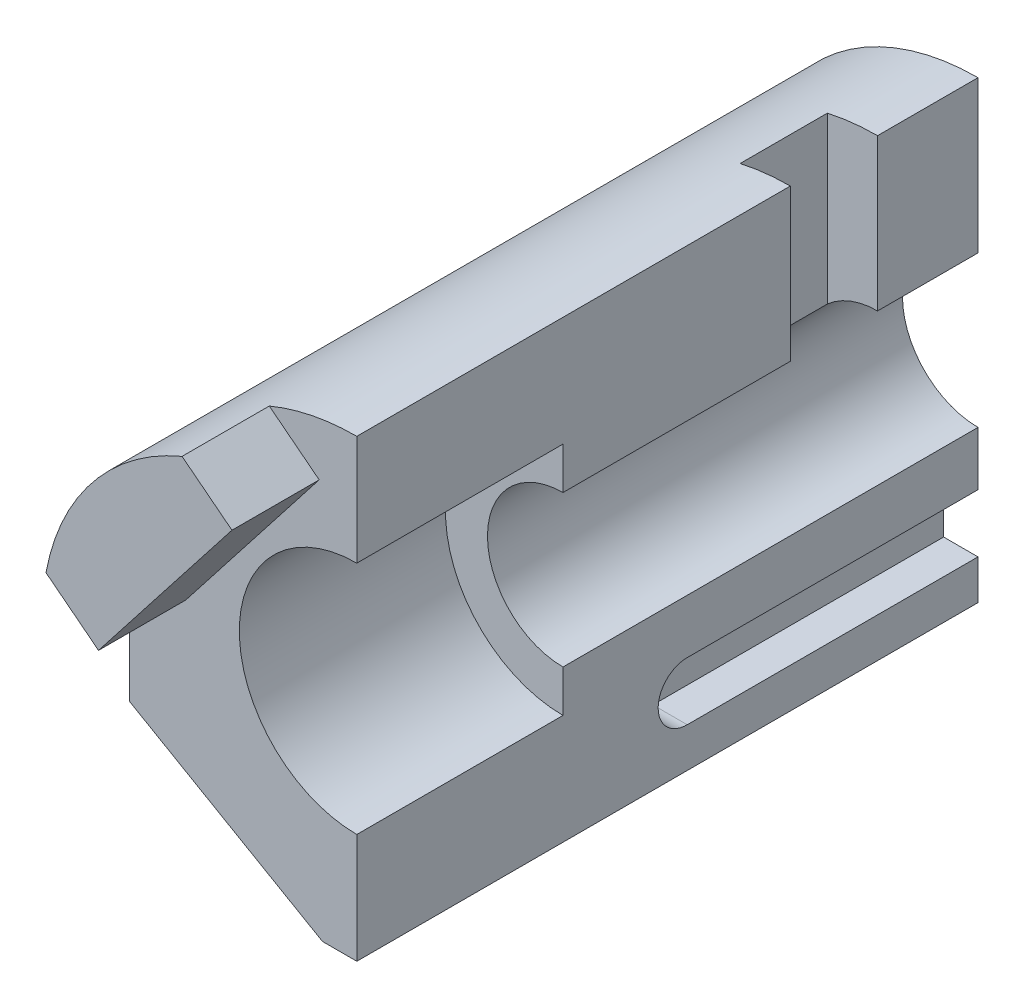
ISO-10303-21;
HEADER;
FILE_DESCRIPTION(('STEP AP214'),'2;1');
FILE_NAME('part.step','',(''),(''),'','','');
FILE_SCHEMA(('AUTOMOTIVE_DESIGN { 1 0 10303 214 1 1 1 1 }'));
ENDSEC;
DATA;
#1=APPLICATION_CONTEXT('core data for automotive mechanical design processes');
#2=APPLICATION_PROTOCOL_DEFINITION('international standard','automotive_design',2000,#1);
#3=PRODUCT_CONTEXT('',#1,'mechanical');
#4=PRODUCT('Part','Part','',(#3));
#5=PRODUCT_RELATED_PRODUCT_CATEGORY('part','',(#4));
#6=PRODUCT_DEFINITION_FORMATION('','',#4);
#7=PRODUCT_DEFINITION_CONTEXT('part definition',#1,'design');
#8=PRODUCT_DEFINITION('design','',#6,#7);
#9=PRODUCT_DEFINITION_SHAPE('','',#8);
#10=(LENGTH_UNIT() NAMED_UNIT(*) SI_UNIT(.MILLI.,.METRE.));
#11=(NAMED_UNIT(*) PLANE_ANGLE_UNIT() SI_UNIT($,.RADIAN.));
#12=(NAMED_UNIT(*) SI_UNIT($,.STERADIAN.) SOLID_ANGLE_UNIT());
#13=UNCERTAINTY_MEASURE_WITH_UNIT(LENGTH_MEASURE(1.E-05),#10,'distance_accuracy_value','');
#14=(GEOMETRIC_REPRESENTATION_CONTEXT(3) GLOBAL_UNCERTAINTY_ASSIGNED_CONTEXT((#13)) GLOBAL_UNIT_ASSIGNED_CONTEXT((#10,
#11,#12)) REPRESENTATION_CONTEXT('',''));
#15=CARTESIAN_POINT('',(0.,0.,0.));
#16=DIRECTION('',(0.,0.,1.));
#17=DIRECTION('',(1.,0.,0.));
#18=AXIS2_PLACEMENT_3D('',#15,#16,#17);
#19=CARTESIAN_POINT('',(0.,-86.,235.));
#20=DIRECTION('',(-1.,0.,0.));
#21=DIRECTION('',(0.,0.,1.));
#22=AXIS2_PLACEMENT_3D('',#19,#20,#21);
#23=PLANE('',#22);
#24=DIRECTION('',(0.,0.,-1.));
#25=VECTOR('',#24,1.);
#26=CARTESIAN_POINT('',(0.,-49.,0.));
#27=LINE('',#26,#25);
#28=CARTESIAN_POINT('',(0.,-49.,110.));
#29=VERTEX_POINT('',#28);
#30=CARTESIAN_POINT('',(0.,-49.,0.));
#31=VERTEX_POINT('',#30);
#32=EDGE_CURVE('E194',#29,#31,#27,.T.);
#33=ORIENTED_EDGE('',*,*,#32,.T.);
#34=DIRECTION('',(0.,1.,0.));
#35=VECTOR('',#34,1.);
#36=CARTESIAN_POINT('',(0.,-86.,0.));
#37=LINE('',#36,#35);
#38=CARTESIAN_POINT('',(0.,-28.575,0.));
#39=VERTEX_POINT('',#38);
#40=EDGE_CURVE('E318',#31,#39,#37,.T.);
#41=ORIENTED_EDGE('',*,*,#40,.T.);
#42=DIRECTION('',(0.,0.,1.));
#43=VECTOR('',#42,1.);
#44=CARTESIAN_POINT('',(0.,-28.575,0.));
#45=LINE('',#44,#43);
#46=CARTESIAN_POINT('',(0.,-28.575,157.));
#47=VERTEX_POINT('',#46);
#48=EDGE_CURVE('E277',#39,#47,#45,.T.);
#49=ORIENTED_EDGE('',*,*,#48,.T.);
#50=DIRECTION('',(0.,1.,0.));
#51=VECTOR('',#50,1.);
#52=CARTESIAN_POINT('',(0.,-86.,157.));
#53=LINE('',#52,#51);
#54=CARTESIAN_POINT('',(0.,-44.45,157.));
#55=VERTEX_POINT('',#54);
#56=EDGE_CURVE('E335',#55,#47,#53,.T.);
#57=ORIENTED_EDGE('',*,*,#56,.F.);
#58=DIRECTION('',(0.,0.,1.));
#59=VECTOR('',#58,1.);
#60=CARTESIAN_POINT('',(0.,-44.45,157.));
#61=LINE('',#60,#59);
#62=CARTESIAN_POINT('',(0.,-44.45,235.));
#63=VERTEX_POINT('',#62);
#64=EDGE_CURVE('E288',#55,#63,#61,.T.);
#65=ORIENTED_EDGE('',*,*,#64,.T.);
#66=DIRECTION('',(0.,1.,0.));
#67=VECTOR('',#66,1.);
#68=CARTESIAN_POINT('',(0.,-86.,235.));
#69=LINE('',#68,#67);
#70=CARTESIAN_POINT('',(0.,-86.,235.));
#71=VERTEX_POINT('',#70);
#72=EDGE_CURVE('E302',#71,#63,#69,.T.);
#73=ORIENTED_EDGE('',*,*,#72,.F.);
#74=DIRECTION('',(0.,0.,-1.));
#75=VECTOR('',#74,1.);
#76=CARTESIAN_POINT('',(0.,-86.,235.));
#77=LINE('',#76,#75);
#78=CARTESIAN_POINT('',(0.,-86.,0.));
#79=VERTEX_POINT('',#78);
#80=EDGE_CURVE('E322',#71,#79,#77,.T.);
#81=ORIENTED_EDGE('',*,*,#80,.T.);
#82=CARTESIAN_POINT('',(0.,-71.,0.));
#83=VERTEX_POINT('',#82);
#84=EDGE_CURVE('E315',#79,#83,#37,.T.);
#85=ORIENTED_EDGE('',*,*,#84,.T.);
#86=DIRECTION('',(0.,0.,-1.));
#87=VECTOR('',#86,1.);
#88=CARTESIAN_POINT('',(0.,-71.,0.));
#89=LINE('',#88,#87);
#90=CARTESIAN_POINT('',(0.,-71.,110.));
#91=VERTEX_POINT('',#90);
#92=EDGE_CURVE('E206',#91,#83,#89,.T.);
#93=ORIENTED_EDGE('',*,*,#92,.F.);
#94=CARTESIAN_POINT('',(0.,-60.,110.));
#95=DIRECTION('',(1.,0.,0.));
#96=DIRECTION('',(0.,0.,-1.));
#97=AXIS2_PLACEMENT_3D('',#94,#95,#96);
#98=CIRCLE('',#97,11.);
#99=EDGE_CURVE('E214',#29,#91,#98,.T.);
#100=ORIENTED_EDGE('',*,*,#99,.F.);
#101=EDGE_LOOP('',(#33,#41,#49,#57,#65,#73,#81,#85,#93,#100));
#102=FACE_BOUND('',#101,.T.);
#103=ADVANCED_FACE('F45',(#102),#23,.F.);
#104=CARTESIAN_POINT('',(0.,0.,0.));
#105=DIRECTION('',(0.,0.,1.));
#106=DIRECTION('',(1.,0.,0.));
#107=AXIS2_PLACEMENT_3D('',#104,#105,#106);
#108=PLANE('',#107);
#109=DIRECTION('',(1.,0.,0.));
#110=VECTOR('',#109,1.);
#111=CARTESIAN_POINT('',(-13.,-49.,0.));
#112=LINE('',#111,#110);
#113=CARTESIAN_POINT('',(-13.,-49.,0.));
#114=VERTEX_POINT('',#113);
#115=EDGE_CURVE('E217',#114,#31,#112,.T.);
#116=ORIENTED_EDGE('',*,*,#115,.F.);
#117=DIRECTION('',(0.,1.,0.));
#118=VECTOR('',#117,1.);
#119=CARTESIAN_POINT('',(-13.,0.,0.));
#120=LINE('',#119,#118);
#121=CARTESIAN_POINT('',(-13.,-71.,0.));
#122=VERTEX_POINT('',#121);
#123=EDGE_CURVE('E200',#122,#114,#120,.T.);
#124=ORIENTED_EDGE('',*,*,#123,.F.);
#125=DIRECTION('',(1.,0.,0.));
#126=VECTOR('',#125,1.);
#127=CARTESIAN_POINT('',(-13.,-71.,0.));
#128=LINE('',#127,#126);
#129=EDGE_CURVE('E220',#122,#83,#128,.T.);
#130=ORIENTED_EDGE('',*,*,#129,.T.);
#131=ORIENTED_EDGE('',*,*,#84,.F.);
#132=DIRECTION('',(1.,0.,0.));
#133=VECTOR('',#132,1.);
#134=CARTESIAN_POINT('',(0.,-86.,0.));
#135=LINE('',#134,#133);
#136=CARTESIAN_POINT('',(-13.,-86.,0.));
#137=VERTEX_POINT('',#136);
#138=EDGE_CURVE('E312',#137,#79,#135,.T.);
#139=ORIENTED_EDGE('',*,*,#138,.F.);
#140=DIRECTION('',(0.866025403784438,-0.500000000000001,0.));
#141=VECTOR('',#140,1.);
#142=CARTESIAN_POINT('',(-13.,-86.,0.));
#143=LINE('',#142,#141);
#144=CARTESIAN_POINT('',(-86.,-43.8534303491572,0.));
#145=VERTEX_POINT('',#144);
#146=EDGE_CURVE('E310',#145,#137,#143,.T.);
#147=ORIENTED_EDGE('',*,*,#146,.F.);
#148=DIRECTION('',(0.,-1.,0.));
#149=VECTOR('',#148,1.);
#150=CARTESIAN_POINT('',(-86.,-6.00534790281019E-13,0.));
#151=LINE('',#150,#149);
#152=CARTESIAN_POINT('',(-86.,-6.00534790281019E-13,0.));
#153=VERTEX_POINT('',#152);
#154=EDGE_CURVE('E308',#153,#145,#151,.T.);
#155=ORIENTED_EDGE('',*,*,#154,.F.);
#156=CARTESIAN_POINT('',(0.,0.,0.));
#157=DIRECTION('',(0.,0.,1.));
#158=DIRECTION('',(1.,0.,0.));
#159=AXIS2_PLACEMENT_3D('',#156,#157,#158);
#160=CIRCLE('',#159,86.);
#161=CARTESIAN_POINT('',(0.,86.,0.));
#162=VERTEX_POINT('',#161);
#163=EDGE_CURVE('E291',#162,#153,#160,.T.);
#164=ORIENTED_EDGE('',*,*,#163,.F.);
#165=CARTESIAN_POINT('',(0.,28.575,0.));
#166=VERTEX_POINT('',#165);
#167=EDGE_CURVE('E314',#166,#162,#37,.T.);
#168=ORIENTED_EDGE('',*,*,#167,.F.);
#169=CARTESIAN_POINT('',(0.,0.,0.));
#170=DIRECTION('',(0.,0.,1.));
#171=DIRECTION('',(1.,0.,0.));
#172=AXIS2_PLACEMENT_3D('',#169,#170,#171);
#173=CIRCLE('',#172,28.575);
#174=EDGE_CURVE('E269',#166,#39,#173,.T.);
#175=ORIENTED_EDGE('',*,*,#174,.T.);
#176=ORIENTED_EDGE('',*,*,#40,.F.);
#177=EDGE_LOOP('',(#116,#124,#130,#131,#139,#147,#155,#164,#168,#175,#176));
#178=FACE_BOUND('',#177,.T.);
#179=ADVANCED_FACE('F373',(#178),#108,.F.);
#180=DIRECTION('',(0.,0.,-1.));
#181=VECTOR('',#180,1.);
#182=CARTESIAN_POINT('',(0.,86.,235.));
#183=LINE('',#182,#181);
#184=CARTESIAN_POINT('',(0.,86.,38.));
#185=VERTEX_POINT('',#184);
#186=EDGE_CURVE('E305',#185,#162,#183,.T.);
#187=ORIENTED_EDGE('',*,*,#186,.F.);
#188=DIRECTION('',(0.,1.,0.));
#189=VECTOR('',#188,1.);
#190=CARTESIAN_POINT('',(0.,4.33599972747388,38.));
#191=LINE('',#190,#189);
#192=CARTESIAN_POINT('',(0.,28.575,38.));
#193=VERTEX_POINT('',#192);
#194=EDGE_CURVE('E219',#193,#185,#191,.T.);
#195=ORIENTED_EDGE('',*,*,#194,.F.);
#196=DIRECTION('',(0.,0.,1.));
#197=VECTOR('',#196,1.);
#198=CARTESIAN_POINT('',(0.,28.575,0.));
#199=LINE('',#198,#197);
#200=EDGE_CURVE('E272',#193,#166,#199,.F.);
#201=ORIENTED_EDGE('',*,*,#200,.T.);
#202=ORIENTED_EDGE('',*,*,#167,.T.);
#203=EDGE_LOOP('',(#187,#195,#201,#202));
#204=FACE_BOUND('',#203,.T.);
#205=ADVANCED_FACE('F385',(#204),#23,.F.);
#206=CARTESIAN_POINT('',(0.,0.,235.));
#207=DIRECTION('',(0.,0.,1.));
#208=DIRECTION('',(1.,0.,0.));
#209=AXIS2_PLACEMENT_3D('',#206,#207,#208);
#210=PLANE('',#209);
#211=DIRECTION('',(0.61566147532566,0.788010753606721,0.));
#212=VECTOR('',#211,1.);
#213=CARTESIAN_POINT('',(-40.1885484339428,31.3987352416086,235.));
#214=LINE('',#213,#212);
#215=CARTESIAN_POINT('',(-64.7199289687016,0.,235.));
#216=VERTEX_POINT('',#215);
#217=CARTESIAN_POINT('',(-14.2356879919975,64.6168817957511,235.));
#218=VERTEX_POINT('',#217);
#219=EDGE_CURVE('E252',#216,#218,#214,.T.);
#220=ORIENTED_EDGE('',*,*,#219,.F.);
#221=DIRECTION('',(-0.788010753606721,0.615661475325659,0.));
#222=VECTOR('',#221,1.);
#223=CARTESIAN_POINT('',(-24.5313805347588,-31.3987352416086,235.));
#224=LINE('',#223,#222);
#225=CARTESIAN_POINT('',(-84.587575845109,15.5223069370482,235.));
#226=VERTEX_POINT('',#225);
#227=EDGE_CURVE('E239',#216,#226,#224,.T.);
#228=ORIENTED_EDGE('',*,*,#227,.T.);
#229=CARTESIAN_POINT('',(0.,0.,235.));
#230=DIRECTION('',(0.,0.,1.));
#231=DIRECTION('',(1.,0.,0.));
#232=AXIS2_PLACEMENT_3D('',#229,#230,#231);
#233=CIRCLE('',#232,86.);
#234=CARTESIAN_POINT('',(-86.,-6.00534790281019E-13,235.));
#235=VERTEX_POINT('',#234);
#236=EDGE_CURVE('E295',#226,#235,#233,.T.);
#237=ORIENTED_EDGE('',*,*,#236,.T.);
#238=DIRECTION('',(0.,-1.,0.));
#239=VECTOR('',#238,1.);
#240=CARTESIAN_POINT('',(-86.,-6.00534790281019E-13,235.));
#241=LINE('',#240,#239);
#242=CARTESIAN_POINT('',(-86.,-43.8534303491572,235.));
#243=VERTEX_POINT('',#242);
#244=EDGE_CURVE('E294',#235,#243,#241,.T.);
#245=ORIENTED_EDGE('',*,*,#244,.T.);
#246=DIRECTION('',(0.866025403784438,-0.500000000000001,0.));
#247=VECTOR('',#246,1.);
#248=CARTESIAN_POINT('',(-13.,-86.,235.));
#249=LINE('',#248,#247);
#250=CARTESIAN_POINT('',(-13.,-86.,235.));
#251=VERTEX_POINT('',#250);
#252=EDGE_CURVE('E297',#243,#251,#249,.T.);
#253=ORIENTED_EDGE('',*,*,#252,.T.);
#254=DIRECTION('',(1.,0.,0.));
#255=VECTOR('',#254,1.);
#256=CARTESIAN_POINT('',(0.,-86.,235.));
#257=LINE('',#256,#255);
#258=EDGE_CURVE('E299',#251,#71,#257,.T.);
#259=ORIENTED_EDGE('',*,*,#258,.T.);
#260=ORIENTED_EDGE('',*,*,#72,.T.);
#261=CARTESIAN_POINT('',(0.,0.,235.));
#262=DIRECTION('',(0.,0.,1.));
#263=DIRECTION('',(1.,0.,0.));
#264=AXIS2_PLACEMENT_3D('',#261,#262,#263);
#265=CIRCLE('',#264,44.45);
#266=CARTESIAN_POINT('',(0.,44.45,235.));
#267=VERTEX_POINT('',#266);
#268=EDGE_CURVE('E280',#267,#63,#265,.T.);
#269=ORIENTED_EDGE('',*,*,#268,.F.);
#270=CARTESIAN_POINT('',(0.,86.,235.));
#271=VERTEX_POINT('',#270);
#272=EDGE_CURVE('E301',#267,#271,#69,.T.);
#273=ORIENTED_EDGE('',*,*,#272,.T.);
#274=CARTESIAN_POINT('',(-33.116437077452,79.3681396738966,235.));
#275=VERTEX_POINT('',#274);
#276=EDGE_CURVE('E292',#271,#275,#233,.T.);
#277=ORIENTED_EDGE('',*,*,#276,.T.);
#278=DIRECTION('',(-0.788010753606721,0.61566147532566,0.));
#279=VECTOR('',#278,1.);
#280=CARTESIAN_POINT('',(25.9528604419453,33.2181465541425,235.));
#281=LINE('',#280,#279);
#282=EDGE_CURVE('E244',#218,#275,#281,.T.);
#283=ORIENTED_EDGE('',*,*,#282,.F.);
#284=EDGE_LOOP('',(#220,#228,#237,#245,#253,#259,#260,#269,#273,#277,#283));
#285=FACE_BOUND('',#284,.T.);
#286=ADVANCED_FACE('F362',(#285),#210,.T.);
#287=CARTESIAN_POINT('',(0.,0.,235.));
#288=DIRECTION('',(0.,0.,-1.));
#289=DIRECTION('',(-1.,0.,0.));
#290=AXIS2_PLACEMENT_3D('',#287,#288,#289);
#291=CYLINDRICAL_SURFACE('',#290,86.);
#292=DIRECTION('',(0.,0.,-1.));
#293=VECTOR('',#292,1.);
#294=CARTESIAN_POINT('',(-19.,83.8749068553879,235.));
#295=LINE('',#294,#293);
#296=CARTESIAN_POINT('',(-19.,83.8749068553879,38.));
#297=VERTEX_POINT('',#296);
#298=CARTESIAN_POINT('',(-19.,83.8749068553879,71.));
#299=VERTEX_POINT('',#298);
#300=EDGE_CURVE('E229',#297,#299,#295,.F.);
#301=ORIENTED_EDGE('',*,*,#300,.F.);
#302=CARTESIAN_POINT('',(0.,0.,38.));
#303=DIRECTION('',(0.,0.,-1.));
#304=DIRECTION('',(-1.,0.,0.));
#305=AXIS2_PLACEMENT_3D('',#302,#303,#304);
#306=CIRCLE('',#305,86.);
#307=EDGE_CURVE('E236',#297,#185,#306,.T.);
#308=ORIENTED_EDGE('',*,*,#307,.T.);
#309=ORIENTED_EDGE('',*,*,#186,.T.);
#310=ORIENTED_EDGE('',*,*,#163,.T.);
#311=DIRECTION('',(0.,0.,-1.));
#312=VECTOR('',#311,1.);
#313=CARTESIAN_POINT('',(-86.,-6.00534790281019E-13,235.));
#314=LINE('',#313,#312);
#315=EDGE_CURVE('E331',#235,#153,#314,.T.);
#316=ORIENTED_EDGE('',*,*,#315,.F.);
#317=ORIENTED_EDGE('',*,*,#236,.F.);
#318=DIRECTION('',(0.,0.,-1.));
#319=VECTOR('',#318,1.);
#320=CARTESIAN_POINT('',(-84.587575845109,15.5223069370482,268.));
#321=LINE('',#320,#319);
#322=CARTESIAN_POINT('',(-84.587575845109,15.5223069370482,268.));
#323=VERTEX_POINT('',#322);
#324=EDGE_CURVE('E250',#323,#226,#321,.T.);
#325=ORIENTED_EDGE('',*,*,#324,.F.);
#326=CARTESIAN_POINT('',(0.,0.,268.));
#327=DIRECTION('',(0.,0.,1.));
#328=DIRECTION('',(1.,0.,0.));
#329=AXIS2_PLACEMENT_3D('',#326,#327,#328);
#330=CIRCLE('',#329,86.);
#331=CARTESIAN_POINT('',(-33.116437077452,79.3681396738966,268.));
#332=VERTEX_POINT('',#331);
#333=EDGE_CURVE('E248',#332,#323,#330,.T.);
#334=ORIENTED_EDGE('',*,*,#333,.F.);
#335=DIRECTION('',(0.,0.,-1.));
#336=VECTOR('',#335,1.);
#337=CARTESIAN_POINT('',(-33.116437077452,79.3681396738966,268.));
#338=LINE('',#337,#336);
#339=EDGE_CURVE('E259',#332,#275,#338,.T.);
#340=ORIENTED_EDGE('',*,*,#339,.T.);
#341=ORIENTED_EDGE('',*,*,#276,.F.);
#342=CARTESIAN_POINT('',(0.,86.,71.));
#343=VERTEX_POINT('',#342);
#344=EDGE_CURVE('E319',#271,#343,#183,.T.);
#345=ORIENTED_EDGE('',*,*,#344,.T.);
#346=CARTESIAN_POINT('',(0.,0.,71.));
#347=DIRECTION('',(0.,0.,1.));
#348=DIRECTION('',(0.,-1.,0.));
#349=AXIS2_PLACEMENT_3D('',#346,#347,#348);
#350=CIRCLE('',#349,86.);
#351=EDGE_CURVE('E233',#343,#299,#350,.T.);
#352=ORIENTED_EDGE('',*,*,#351,.T.);
#353=EDGE_LOOP('',(#301,#308,#309,#310,#316,#317,#325,#334,#340,#341,#345,#352));
#354=FACE_BOUND('',#353,.T.);
#355=ADVANCED_FACE('F47',(#354),#291,.T.);
#356=CARTESIAN_POINT('',(-86.,-6.00534790281019E-13,235.));
#357=DIRECTION('',(1.,0.,0.));
#358=DIRECTION('',(0.,1.,0.));
#359=AXIS2_PLACEMENT_3D('',#356,#357,#358);
#360=PLANE('',#359);
#361=ORIENTED_EDGE('',*,*,#154,.T.);
#362=DIRECTION('',(0.,0.,-1.));
#363=VECTOR('',#362,1.);
#364=CARTESIAN_POINT('',(-86.,-43.8534303491572,235.));
#365=LINE('',#364,#363);
#366=EDGE_CURVE('E328',#243,#145,#365,.T.);
#367=ORIENTED_EDGE('',*,*,#366,.F.);
#368=ORIENTED_EDGE('',*,*,#244,.F.);
#369=ORIENTED_EDGE('',*,*,#315,.T.);
#370=EDGE_LOOP('',(#361,#367,#368,#369));
#371=FACE_BOUND('',#370,.T.);
#372=ADVANCED_FACE('F444',(#371),#360,.F.);
#373=CARTESIAN_POINT('',(-13.,-86.,235.));
#374=DIRECTION('',(0.500000000000001,0.866025403784438,0.));
#375=DIRECTION('',(-0.866025403784438,0.500000000000001,0.));
#376=AXIS2_PLACEMENT_3D('',#373,#374,#375);
#377=PLANE('',#376);
#378=ORIENTED_EDGE('',*,*,#146,.T.);
#379=DIRECTION('',(0.,0.,-1.));
#380=VECTOR('',#379,1.);
#381=CARTESIAN_POINT('',(-13.,-86.,235.));
#382=LINE('',#381,#380);
#383=EDGE_CURVE('E325',#251,#137,#382,.T.);
#384=ORIENTED_EDGE('',*,*,#383,.F.);
#385=ORIENTED_EDGE('',*,*,#252,.F.);
#386=ORIENTED_EDGE('',*,*,#366,.T.);
#387=EDGE_LOOP('',(#378,#384,#385,#386));
#388=FACE_BOUND('',#387,.T.);
#389=ADVANCED_FACE('F439',(#388),#377,.F.);
#390=CARTESIAN_POINT('',(0.,-86.,235.));
#391=DIRECTION('',(0.,1.,0.));
#392=DIRECTION('',(0.,0.,1.));
#393=AXIS2_PLACEMENT_3D('',#390,#391,#392);
#394=PLANE('',#393);
#395=ORIENTED_EDGE('',*,*,#138,.T.);
#396=ORIENTED_EDGE('',*,*,#80,.F.);
#397=ORIENTED_EDGE('',*,*,#258,.F.);
#398=ORIENTED_EDGE('',*,*,#383,.T.);
#399=EDGE_LOOP('',(#395,#396,#397,#398));
#400=FACE_BOUND('',#399,.T.);
#401=ADVANCED_FACE('F368',(#400),#394,.F.);
#402=CARTESIAN_POINT('',(0.,28.575,157.));
#403=VERTEX_POINT('',#402);
#404=CARTESIAN_POINT('',(0.,28.575,71.));
#405=VERTEX_POINT('',#404);
#406=EDGE_CURVE('E274',#403,#405,#199,.F.);
#407=ORIENTED_EDGE('',*,*,#406,.T.);
#408=DIRECTION('',(0.,-1.,0.));
#409=VECTOR('',#408,1.);
#410=CARTESIAN_POINT('',(0.,94.3359997274739,71.));
#411=LINE('',#410,#409);
#412=EDGE_CURVE('E227',#343,#405,#411,.T.);
#413=ORIENTED_EDGE('',*,*,#412,.F.);
#414=ORIENTED_EDGE('',*,*,#344,.F.);
#415=ORIENTED_EDGE('',*,*,#272,.F.);
#416=DIRECTION('',(0.,0.,1.));
#417=VECTOR('',#416,1.);
#418=CARTESIAN_POINT('',(0.,44.45,157.));
#419=LINE('',#418,#417);
#420=CARTESIAN_POINT('',(0.,44.45,157.));
#421=VERTEX_POINT('',#420);
#422=EDGE_CURVE('E284',#267,#421,#419,.F.);
#423=ORIENTED_EDGE('',*,*,#422,.T.);
#424=EDGE_CURVE('E334',#403,#421,#53,.T.);
#425=ORIENTED_EDGE('',*,*,#424,.F.);
#426=EDGE_LOOP('',(#407,#413,#414,#415,#423,#425));
#427=FACE_BOUND('',#426,.T.);
#428=ADVANCED_FACE('F349',(#427),#23,.F.);
#429=CARTESIAN_POINT('',(0.,0.,157.));
#430=DIRECTION('',(0.,0.,1.));
#431=DIRECTION('',(1.,0.,0.));
#432=AXIS2_PLACEMENT_3D('',#429,#430,#431);
#433=PLANE('',#432);
#434=CARTESIAN_POINT('',(0.,0.,157.));
#435=DIRECTION('',(0.,0.,1.));
#436=DIRECTION('',(1.,0.,0.));
#437=AXIS2_PLACEMENT_3D('',#434,#435,#436);
#438=CIRCLE('',#437,28.575);
#439=EDGE_CURVE('E268',#403,#47,#438,.T.);
#440=ORIENTED_EDGE('',*,*,#439,.F.);
#441=ORIENTED_EDGE('',*,*,#424,.T.);
#442=CARTESIAN_POINT('',(0.,0.,157.));
#443=DIRECTION('',(0.,0.,1.));
#444=DIRECTION('',(1.,0.,0.));
#445=AXIS2_PLACEMENT_3D('',#442,#443,#444);
#446=CIRCLE('',#445,44.45);
#447=EDGE_CURVE('E281',#421,#55,#446,.T.);
#448=ORIENTED_EDGE('',*,*,#447,.T.);
#449=ORIENTED_EDGE('',*,*,#56,.T.);
#450=EDGE_LOOP('',(#440,#441,#448,#449));
#451=FACE_BOUND('',#450,.T.);
#452=ADVANCED_FACE('F354',(#451),#433,.T.);
#453=CARTESIAN_POINT('',(0.,0.,157.));
#454=DIRECTION('',(0.,0.,1.));
#455=DIRECTION('',(1.,0.,0.));
#456=AXIS2_PLACEMENT_3D('',#453,#454,#455);
#457=CYLINDRICAL_SURFACE('',#456,44.45);
#458=ORIENTED_EDGE('',*,*,#447,.F.);
#459=ORIENTED_EDGE('',*,*,#422,.F.);
#460=ORIENTED_EDGE('',*,*,#268,.T.);
#461=ORIENTED_EDGE('',*,*,#64,.F.);
#462=EDGE_LOOP('',(#458,#459,#460,#461));
#463=FACE_BOUND('',#462,.T.);
#464=ADVANCED_FACE('F357',(#463),#457,.F.);
#465=CARTESIAN_POINT('',(0.,0.,0.));
#466=DIRECTION('',(0.,0.,1.));
#467=DIRECTION('',(1.,0.,0.));
#468=AXIS2_PLACEMENT_3D('',#465,#466,#467);
#469=CYLINDRICAL_SURFACE('',#468,28.575);
#470=ORIENTED_EDGE('',*,*,#200,.F.);
#471=CARTESIAN_POINT('',(0.,0.,38.));
#472=DIRECTION('',(0.,0.,-1.));
#473=DIRECTION('',(-1.,0.,0.));
#474=AXIS2_PLACEMENT_3D('',#471,#472,#473);
#475=CIRCLE('',#474,28.575);
#476=CARTESIAN_POINT('',(-19.,21.3431634253219,38.));
#477=VERTEX_POINT('',#476);
#478=EDGE_CURVE('E11',#193,#477,#475,.F.);
#479=ORIENTED_EDGE('',*,*,#478,.T.);
#480=DIRECTION('',(0.,0.,1.));
#481=VECTOR('',#480,1.);
#482=CARTESIAN_POINT('',(-19.,21.3431634253219,0.));
#483=LINE('',#482,#481);
#484=CARTESIAN_POINT('',(-19.,21.3431634253219,71.));
#485=VERTEX_POINT('',#484);
#486=EDGE_CURVE('E338',#485,#477,#483,.F.);
#487=ORIENTED_EDGE('',*,*,#486,.F.);
#488=CARTESIAN_POINT('',(0.,0.,71.));
#489=DIRECTION('',(0.,0.,1.));
#490=DIRECTION('',(0.,-1.,0.));
#491=AXIS2_PLACEMENT_3D('',#488,#489,#490);
#492=CIRCLE('',#491,28.575);
#493=EDGE_CURVE('E53',#485,#405,#492,.F.);
#494=ORIENTED_EDGE('',*,*,#493,.T.);
#495=ORIENTED_EDGE('',*,*,#406,.F.);
#496=ORIENTED_EDGE('',*,*,#439,.T.);
#497=ORIENTED_EDGE('',*,*,#48,.F.);
#498=ORIENTED_EDGE('',*,*,#174,.F.);
#499=EDGE_LOOP('',(#470,#479,#487,#494,#495,#496,#497,#498));
#500=FACE_BOUND('',#499,.T.);
#501=ADVANCED_FACE('F343',(#500),#469,.F.);
#502=CARTESIAN_POINT('',(-24.5313805347588,-31.3987352416086,268.));
#503=DIRECTION('',(-0.615661475325659,-0.788010753606721,0.));
#504=DIRECTION('',(0.788010753606721,-0.615661475325659,0.));
#505=AXIS2_PLACEMENT_3D('',#502,#503,#504);
#506=PLANE('',#505);
#507=ORIENTED_EDGE('',*,*,#227,.F.);
#508=DIRECTION('',(0.,0.,-1.));
#509=VECTOR('',#508,1.);
#510=CARTESIAN_POINT('',(-64.7199289687016,0.,268.));
#511=LINE('',#510,#509);
#512=CARTESIAN_POINT('',(-64.7199289687016,0.,268.));
#513=VERTEX_POINT('',#512);
#514=EDGE_CURVE('E265',#513,#216,#511,.T.);
#515=ORIENTED_EDGE('',*,*,#514,.F.);
#516=DIRECTION('',(-0.788010753606721,0.615661475325659,0.));
#517=VECTOR('',#516,1.);
#518=CARTESIAN_POINT('',(-24.5313805347588,-31.3987352416086,268.));
#519=LINE('',#518,#517);
#520=EDGE_CURVE('E240',#513,#323,#519,.T.);
#521=ORIENTED_EDGE('',*,*,#520,.T.);
#522=ORIENTED_EDGE('',*,*,#324,.T.);
#523=EDGE_LOOP('',(#507,#515,#521,#522));
#524=FACE_BOUND('',#523,.T.);
#525=ADVANCED_FACE('F413',(#524),#506,.T.);
#526=CARTESIAN_POINT('',(-40.1885484339428,31.3987352416086,268.));
#527=DIRECTION('',(-0.788010753606721,0.61566147532566,0.));
#528=DIRECTION('',(-0.61566147532566,-0.788010753606721,0.));
#529=AXIS2_PLACEMENT_3D('',#526,#527,#528);
#530=PLANE('',#529);
#531=ORIENTED_EDGE('',*,*,#219,.T.);
#532=DIRECTION('',(0.,0.,-1.));
#533=VECTOR('',#532,1.);
#534=CARTESIAN_POINT('',(-14.2356879919975,64.6168817957511,268.));
#535=LINE('',#534,#533);
#536=CARTESIAN_POINT('',(-14.2356879919975,64.6168817957511,268.));
#537=VERTEX_POINT('',#536);
#538=EDGE_CURVE('E262',#537,#218,#535,.T.);
#539=ORIENTED_EDGE('',*,*,#538,.F.);
#540=DIRECTION('',(0.61566147532566,0.788010753606721,0.));
#541=VECTOR('',#540,1.);
#542=CARTESIAN_POINT('',(-40.1885484339428,31.3987352416086,268.));
#543=LINE('',#542,#541);
#544=EDGE_CURVE('E243',#513,#537,#543,.T.);
#545=ORIENTED_EDGE('',*,*,#544,.F.);
#546=ORIENTED_EDGE('',*,*,#514,.T.);
#547=EDGE_LOOP('',(#531,#539,#545,#546));
#548=FACE_BOUND('',#547,.T.);
#549=ADVANCED_FACE('F409',(#548),#530,.F.);
#550=CARTESIAN_POINT('',(25.9528604419453,33.2181465541425,268.));
#551=DIRECTION('',(-0.61566147532566,-0.788010753606721,0.));
#552=DIRECTION('',(0.788010753606721,-0.61566147532566,0.));
#553=AXIS2_PLACEMENT_3D('',#550,#551,#552);
#554=PLANE('',#553);
#555=ORIENTED_EDGE('',*,*,#282,.T.);
#556=ORIENTED_EDGE('',*,*,#339,.F.);
#557=DIRECTION('',(-0.788010753606721,0.61566147532566,0.));
#558=VECTOR('',#557,1.);
#559=CARTESIAN_POINT('',(25.9528604419453,33.2181465541425,268.));
#560=LINE('',#559,#558);
#561=EDGE_CURVE('E246',#537,#332,#560,.T.);
#562=ORIENTED_EDGE('',*,*,#561,.F.);
#563=ORIENTED_EDGE('',*,*,#538,.T.);
#564=EDGE_LOOP('',(#555,#556,#562,#563));
#565=FACE_BOUND('',#564,.T.);
#566=ADVANCED_FACE('F399',(#565),#554,.F.);
#567=CARTESIAN_POINT('',(0.,0.,268.));
#568=DIRECTION('',(0.,0.,1.));
#569=DIRECTION('',(1.,0.,0.));
#570=AXIS2_PLACEMENT_3D('',#567,#568,#569);
#571=PLANE('',#570);
#572=ORIENTED_EDGE('',*,*,#520,.F.);
#573=ORIENTED_EDGE('',*,*,#544,.T.);
#574=ORIENTED_EDGE('',*,*,#561,.T.);
#575=ORIENTED_EDGE('',*,*,#333,.T.);
#576=EDGE_LOOP('',(#572,#573,#574,#575));
#577=FACE_BOUND('',#576,.T.);
#578=ADVANCED_FACE('F406',(#577),#571,.T.);
#579=CARTESIAN_POINT('',(-19.,4.33599972747388,38.));
#580=DIRECTION('',(0.,0.,-1.));
#581=DIRECTION('',(-1.,0.,0.));
#582=AXIS2_PLACEMENT_3D('',#579,#580,#581);
#583=PLANE('',#582);
#584=DIRECTION('',(0.,1.,0.));
#585=VECTOR('',#584,1.);
#586=CARTESIAN_POINT('',(-19.,4.33599972747388,38.));
#587=LINE('',#586,#585);
#588=EDGE_CURVE('E224',#477,#297,#587,.T.);
#589=ORIENTED_EDGE('',*,*,#588,.F.);
#590=ORIENTED_EDGE('',*,*,#478,.F.);
#591=ORIENTED_EDGE('',*,*,#194,.T.);
#592=ORIENTED_EDGE('',*,*,#307,.F.);
#593=EDGE_LOOP('',(#589,#590,#591,#592));
#594=FACE_BOUND('',#593,.T.);
#595=ADVANCED_FACE('F393',(#594),#583,.F.);
#596=CARTESIAN_POINT('',(-19.,94.3359997274739,71.));
#597=DIRECTION('',(0.,0.,1.));
#598=DIRECTION('',(0.,-1.,0.));
#599=AXIS2_PLACEMENT_3D('',#596,#597,#598);
#600=PLANE('',#599);
#601=ORIENTED_EDGE('',*,*,#412,.T.);
#602=ORIENTED_EDGE('',*,*,#493,.F.);
#603=DIRECTION('',(0.,-1.,0.));
#604=VECTOR('',#603,1.);
#605=CARTESIAN_POINT('',(-19.,94.3359997274739,71.));
#606=LINE('',#605,#604);
#607=EDGE_CURVE('E68',#299,#485,#606,.T.);
#608=ORIENTED_EDGE('',*,*,#607,.F.);
#609=ORIENTED_EDGE('',*,*,#351,.F.);
#610=EDGE_LOOP('',(#601,#602,#608,#609));
#611=FACE_BOUND('',#610,.T.);
#612=ADVANCED_FACE('F395',(#611),#600,.F.);
#613=CARTESIAN_POINT('',(-19.,0.,0.));
#614=DIRECTION('',(1.,0.,0.));
#615=DIRECTION('',(0.,0.,-1.));
#616=AXIS2_PLACEMENT_3D('',#613,#614,#615);
#617=PLANE('',#616);
#618=ORIENTED_EDGE('',*,*,#300,.T.);
#619=ORIENTED_EDGE('',*,*,#607,.T.);
#620=ORIENTED_EDGE('',*,*,#486,.T.);
#621=ORIENTED_EDGE('',*,*,#588,.T.);
#622=EDGE_LOOP('',(#618,#619,#620,#621));
#623=FACE_BOUND('',#622,.T.);
#624=ADVANCED_FACE('F394',(#623),#617,.T.);
#625=CARTESIAN_POINT('',(-13.,-49.,0.));
#626=DIRECTION('',(0.,-1.,0.));
#627=DIRECTION('',(0.,0.,-1.));
#628=AXIS2_PLACEMENT_3D('',#625,#626,#627);
#629=PLANE('',#628);
#630=ORIENTED_EDGE('',*,*,#32,.F.);
#631=DIRECTION('',(1.,0.,0.));
#632=VECTOR('',#631,1.);
#633=CARTESIAN_POINT('',(-13.,-49.,110.));
#634=LINE('',#633,#632);
#635=CARTESIAN_POINT('',(-13.,-49.,110.));
#636=VERTEX_POINT('',#635);
#637=EDGE_CURVE('E189',#636,#29,#634,.T.);
#638=ORIENTED_EDGE('',*,*,#637,.F.);
#639=DIRECTION('',(0.,0.,-1.));
#640=VECTOR('',#639,1.);
#641=CARTESIAN_POINT('',(-13.,-49.,0.));
#642=LINE('',#641,#640);
#643=EDGE_CURVE('E192',#636,#114,#642,.T.);
#644=ORIENTED_EDGE('',*,*,#643,.T.);
#645=ORIENTED_EDGE('',*,*,#115,.T.);
#646=EDGE_LOOP('',(#630,#638,#644,#645));
#647=FACE_BOUND('',#646,.T.);
#648=ADVANCED_FACE('F191',(#647),#629,.T.);
#649=CARTESIAN_POINT('',(-13.,-71.,0.));
#650=DIRECTION('',(0.,-1.,0.));
#651=DIRECTION('',(0.,0.,-1.));
#652=AXIS2_PLACEMENT_3D('',#649,#650,#651);
#653=PLANE('',#652);
#654=ORIENTED_EDGE('',*,*,#92,.T.);
#655=ORIENTED_EDGE('',*,*,#129,.F.);
#656=DIRECTION('',(0.,0.,-1.));
#657=VECTOR('',#656,1.);
#658=CARTESIAN_POINT('',(-13.,-71.,0.));
#659=LINE('',#658,#657);
#660=CARTESIAN_POINT('',(-13.,-71.,110.));
#661=VERTEX_POINT('',#660);
#662=EDGE_CURVE('E60',#661,#122,#659,.T.);
#663=ORIENTED_EDGE('',*,*,#662,.F.);
#664=DIRECTION('',(1.,0.,0.));
#665=VECTOR('',#664,1.);
#666=CARTESIAN_POINT('',(-13.,-71.,110.));
#667=LINE('',#666,#665);
#668=EDGE_CURVE('E199',#661,#91,#667,.T.);
#669=ORIENTED_EDGE('',*,*,#668,.T.);
#670=EDGE_LOOP('',(#654,#655,#663,#669));
#671=FACE_BOUND('',#670,.T.);
#672=ADVANCED_FACE('F376',(#671),#653,.F.);
#673=CARTESIAN_POINT('',(-13.,-60.,110.));
#674=DIRECTION('',(1.,0.,0.));
#675=DIRECTION('',(0.,0.,-1.));
#676=AXIS2_PLACEMENT_3D('',#673,#674,#675);
#677=CYLINDRICAL_SURFACE('',#676,11.);
#678=ORIENTED_EDGE('',*,*,#99,.T.);
#679=ORIENTED_EDGE('',*,*,#668,.F.);
#680=CARTESIAN_POINT('',(-13.,-60.,110.));
#681=DIRECTION('',(1.,0.,0.));
#682=DIRECTION('',(0.,0.,-1.));
#683=AXIS2_PLACEMENT_3D('',#680,#681,#682);
#684=CIRCLE('',#683,11.);
#685=EDGE_CURVE('E203',#636,#661,#684,.T.);
#686=ORIENTED_EDGE('',*,*,#685,.F.);
#687=ORIENTED_EDGE('',*,*,#637,.T.);
#688=EDGE_LOOP('',(#678,#679,#686,#687));
#689=FACE_BOUND('',#688,.T.);
#690=ADVANCED_FACE('F208',(#689),#677,.F.);
#691=CARTESIAN_POINT('',(-13.,0.,0.));
#692=DIRECTION('',(1.,0.,0.));
#693=DIRECTION('',(0.,0.,-1.));
#694=AXIS2_PLACEMENT_3D('',#691,#692,#693);
#695=PLANE('',#694);
#696=ORIENTED_EDGE('',*,*,#643,.F.);
#697=ORIENTED_EDGE('',*,*,#685,.T.);
#698=ORIENTED_EDGE('',*,*,#662,.T.);
#699=ORIENTED_EDGE('',*,*,#123,.T.);
#700=EDGE_LOOP('',(#696,#697,#698,#699));
#701=FACE_BOUND('',#700,.T.);
#702=ADVANCED_FACE('F202',(#701),#695,.T.);
#703=CLOSED_SHELL('',(#103,#179,#205,#286,#355,#372,#389,#401,#428,#452,#464,#501,#525,#549,
#566,#578,#595,#612,#624,#648,#672,#690,#702));
#704=MANIFOLD_SOLID_BREP('B2',#703);
#705=ADVANCED_BREP_SHAPE_REPRESENTATION('',(#18,#704),#14);
#706=SHAPE_DEFINITION_REPRESENTATION(#9,#705);
ENDSEC;
END-ISO-10303-21;
